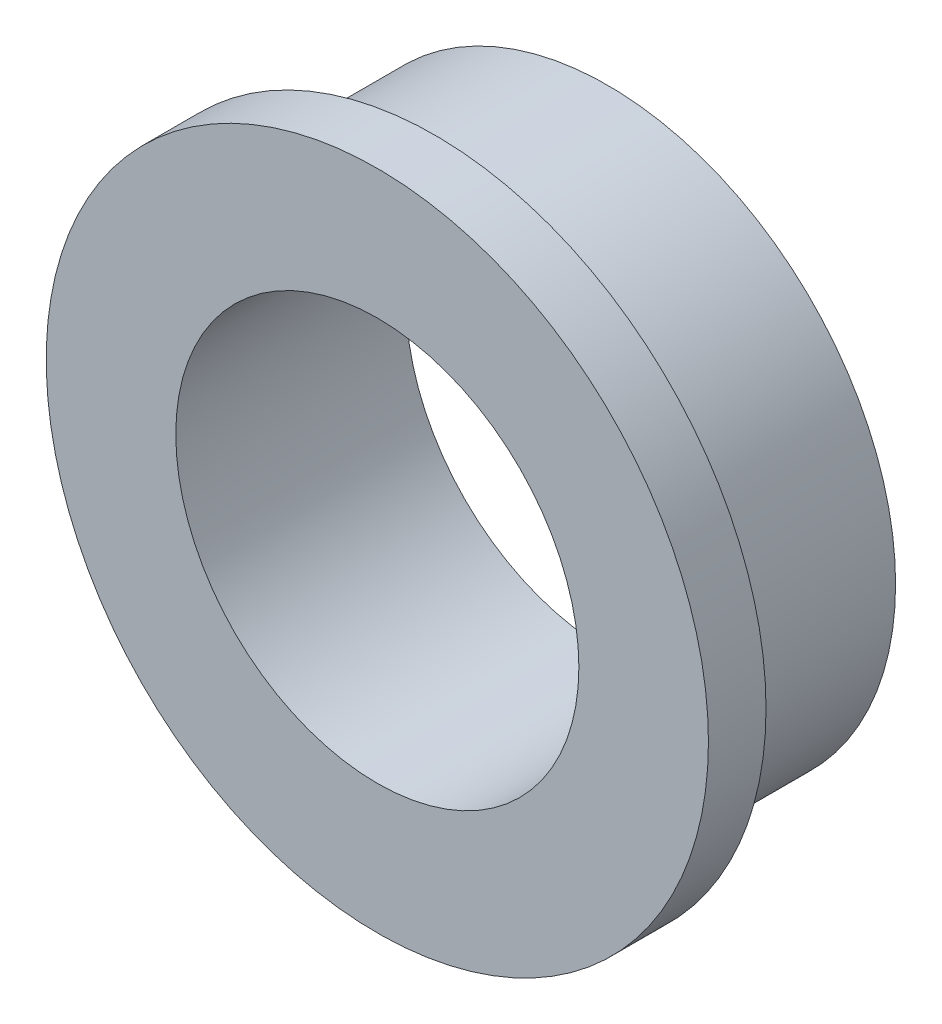
ISO-10303-21;
HEADER;
FILE_DESCRIPTION(('STEP AP214'),'2;1');
FILE_NAME('part.step','',(''),(''),'','','');
FILE_SCHEMA(('AUTOMOTIVE_DESIGN { 1 0 10303 214 1 1 1 1 }'));
ENDSEC;
DATA;
#1=APPLICATION_CONTEXT('core data for automotive mechanical design processes');
#2=APPLICATION_PROTOCOL_DEFINITION('international standard','automotive_design',2000,#1);
#3=PRODUCT_CONTEXT('',#1,'mechanical');
#4=PRODUCT('Part','Part','',(#3));
#5=PRODUCT_RELATED_PRODUCT_CATEGORY('part','',(#4));
#6=PRODUCT_DEFINITION_FORMATION('','',#4);
#7=PRODUCT_DEFINITION_CONTEXT('part definition',#1,'design');
#8=PRODUCT_DEFINITION('design','',#6,#7);
#9=PRODUCT_DEFINITION_SHAPE('','',#8);
#10=(LENGTH_UNIT() NAMED_UNIT(*) SI_UNIT(.MILLI.,.METRE.));
#11=(NAMED_UNIT(*) PLANE_ANGLE_UNIT() SI_UNIT($,.RADIAN.));
#12=(NAMED_UNIT(*) SI_UNIT($,.STERADIAN.) SOLID_ANGLE_UNIT());
#13=UNCERTAINTY_MEASURE_WITH_UNIT(LENGTH_MEASURE(1.E-05),#10,'distance_accuracy_value','');
#14=(GEOMETRIC_REPRESENTATION_CONTEXT(3) GLOBAL_UNCERTAINTY_ASSIGNED_CONTEXT((#13)) GLOBAL_UNIT_ASSIGNED_CONTEXT((#10,
#11,#12)) REPRESENTATION_CONTEXT('',''));
#15=CARTESIAN_POINT('',(0.,0.,0.));
#16=DIRECTION('',(0.,0.,1.));
#17=DIRECTION('',(1.,0.,0.));
#18=AXIS2_PLACEMENT_3D('',#15,#16,#17);
#19=CARTESIAN_POINT('',(0.,0.,4.));
#20=DIRECTION('',(0.,0.,-1.));
#21=DIRECTION('',(-1.,0.,0.));
#22=AXIS2_PLACEMENT_3D('',#19,#20,#21);
#23=CYLINDRICAL_SURFACE('',#22,5.);
#24=CARTESIAN_POINT('',(0.,0.,0.));
#25=DIRECTION('',(0.,0.,1.));
#26=DIRECTION('',(1.,0.,0.));
#27=AXIS2_PLACEMENT_3D('',#24,#25,#26);
#28=CIRCLE('',#27,5.);
#29=CARTESIAN_POINT('',(5.,0.,0.));
#30=VERTEX_POINT('',#29);
#31=EDGE_CURVE('E58',#30,#30,#28,.T.);
#32=ORIENTED_EDGE('',*,*,#31,.T.);
#33=EDGE_LOOP('',(#32));
#34=FACE_BOUND('',#33,.T.);
#35=CARTESIAN_POINT('',(0.,0.,3.));
#36=DIRECTION('',(0.,0.,1.));
#37=DIRECTION('',(1.,0.,0.));
#38=AXIS2_PLACEMENT_3D('',#35,#36,#37);
#39=CIRCLE('',#38,5.);
#40=CARTESIAN_POINT('',(5.,0.,3.));
#41=VERTEX_POINT('',#40);
#42=EDGE_CURVE('E10',#41,#41,#39,.T.);
#43=ORIENTED_EDGE('',*,*,#42,.F.);
#44=EDGE_LOOP('',(#43));
#45=FACE_BOUND('',#44,.T.);
#46=ADVANCED_FACE('F45',(#34,#45),#23,.T.);
#47=CARTESIAN_POINT('',(0.,0.,4.));
#48=DIRECTION('',(0.,0.,-1.));
#49=DIRECTION('',(-1.,0.,0.));
#50=AXIS2_PLACEMENT_3D('',#47,#48,#49);
#51=CYLINDRICAL_SURFACE('',#50,3.5);
#52=CARTESIAN_POINT('',(0.,0.,4.));
#53=DIRECTION('',(0.,0.,1.));
#54=DIRECTION('',(1.,0.,0.));
#55=AXIS2_PLACEMENT_3D('',#52,#53,#54);
#56=CIRCLE('',#55,3.5);
#57=CARTESIAN_POINT('',(3.5,0.,4.));
#58=VERTEX_POINT('',#57);
#59=EDGE_CURVE('E53',#58,#58,#56,.T.);
#60=ORIENTED_EDGE('',*,*,#59,.T.);
#61=EDGE_LOOP('',(#60));
#62=FACE_BOUND('',#61,.T.);
#63=CARTESIAN_POINT('',(0.,0.,0.));
#64=DIRECTION('',(0.,0.,1.));
#65=DIRECTION('',(1.,0.,0.));
#66=AXIS2_PLACEMENT_3D('',#63,#64,#65);
#67=CIRCLE('',#66,3.5);
#68=CARTESIAN_POINT('',(3.5,0.,0.));
#69=VERTEX_POINT('',#68);
#70=EDGE_CURVE('E64',#69,#69,#67,.T.);
#71=ORIENTED_EDGE('',*,*,#70,.F.);
#72=EDGE_LOOP('',(#71));
#73=FACE_BOUND('',#72,.T.);
#74=ADVANCED_FACE('F47',(#62,#73),#51,.F.);
#75=CARTESIAN_POINT('',(0.,0.,4.));
#76=DIRECTION('',(0.,0.,1.));
#77=DIRECTION('',(1.,0.,0.));
#78=AXIS2_PLACEMENT_3D('',#75,#76,#77);
#79=PLANE('',#78);
#80=ORIENTED_EDGE('',*,*,#59,.F.);
#81=EDGE_LOOP('',(#80));
#82=FACE_BOUND('',#81,.T.);
#83=CARTESIAN_POINT('',(0.,0.,4.));
#84=DIRECTION('',(0.,0.,1.));
#85=DIRECTION('',(1.,0.,0.));
#86=AXIS2_PLACEMENT_3D('',#83,#84,#85);
#87=CIRCLE('',#86,5.75);
#88=CARTESIAN_POINT('',(5.75,0.,4.));
#89=VERTEX_POINT('',#88);
#90=EDGE_CURVE('E67',#89,#89,#87,.T.);
#91=ORIENTED_EDGE('',*,*,#90,.T.);
#92=EDGE_LOOP('',(#91));
#93=FACE_BOUND('',#92,.T.);
#94=ADVANCED_FACE('F82',(#82,#93),#79,.T.);
#95=CARTESIAN_POINT('',(0.,0.,0.));
#96=DIRECTION('',(0.,0.,1.));
#97=DIRECTION('',(1.,0.,0.));
#98=AXIS2_PLACEMENT_3D('',#95,#96,#97);
#99=PLANE('',#98);
#100=ORIENTED_EDGE('',*,*,#70,.T.);
#101=EDGE_LOOP('',(#100));
#102=FACE_BOUND('',#101,.T.);
#103=ORIENTED_EDGE('',*,*,#31,.F.);
#104=EDGE_LOOP('',(#103));
#105=FACE_BOUND('',#104,.T.);
#106=ADVANCED_FACE('F87',(#102,#105),#99,.F.);
#107=CARTESIAN_POINT('',(0.,0.,3.));
#108=DIRECTION('',(0.,0.,1.));
#109=DIRECTION('',(1.,0.,0.));
#110=AXIS2_PLACEMENT_3D('',#107,#108,#109);
#111=CYLINDRICAL_SURFACE('',#110,5.75);
#112=CARTESIAN_POINT('',(0.,0.,3.));
#113=DIRECTION('',(0.,0.,1.));
#114=DIRECTION('',(1.,0.,0.));
#115=AXIS2_PLACEMENT_3D('',#112,#113,#114);
#116=CIRCLE('',#115,5.75);
#117=CARTESIAN_POINT('',(5.75,0.,3.));
#118=VERTEX_POINT('',#117);
#119=EDGE_CURVE('E71',#118,#118,#116,.T.);
#120=ORIENTED_EDGE('',*,*,#119,.T.);
#121=EDGE_LOOP('',(#120));
#122=FACE_BOUND('',#121,.T.);
#123=ORIENTED_EDGE('',*,*,#90,.F.);
#124=EDGE_LOOP('',(#123));
#125=FACE_BOUND('',#124,.T.);
#126=ADVANCED_FACE('F84',(#122,#125),#111,.T.);
#127=CARTESIAN_POINT('',(0.,0.,3.));
#128=DIRECTION('',(0.,0.,1.));
#129=DIRECTION('',(1.,0.,0.));
#130=AXIS2_PLACEMENT_3D('',#127,#128,#129);
#131=PLANE('',#130);
#132=ORIENTED_EDGE('',*,*,#42,.T.);
#133=EDGE_LOOP('',(#132));
#134=FACE_BOUND('',#133,.T.);
#135=ORIENTED_EDGE('',*,*,#119,.F.);
#136=EDGE_LOOP('',(#135));
#137=FACE_BOUND('',#136,.T.);
#138=ADVANCED_FACE('F86',(#134,#137),#131,.F.);
#139=CLOSED_SHELL('',(#46,#74,#94,#106,#126,#138));
#140=MANIFOLD_SOLID_BREP('B2',#139);
#141=ADVANCED_BREP_SHAPE_REPRESENTATION('',(#18,#140),#14);
#142=SHAPE_DEFINITION_REPRESENTATION(#9,#141);
ENDSEC;
END-ISO-10303-21;
